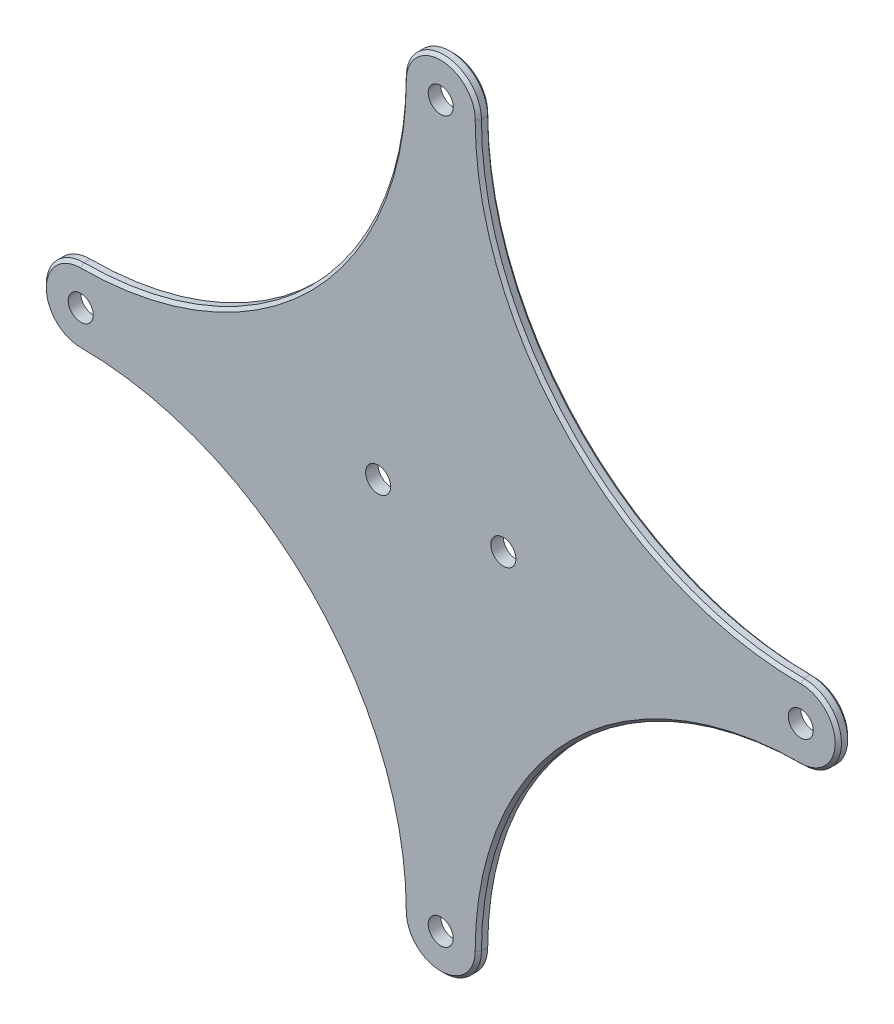
ISO-10303-21;
HEADER;
FILE_DESCRIPTION(('STEP AP214'),'2;1');
FILE_NAME('part.step','',(''),(''),'','','');
FILE_SCHEMA(('AUTOMOTIVE_DESIGN { 1 0 10303 214 1 1 1 1 }'));
ENDSEC;
DATA;
#1=APPLICATION_CONTEXT('core data for automotive mechanical design processes');
#2=APPLICATION_PROTOCOL_DEFINITION('international standard','automotive_design',2000,#1);
#3=PRODUCT_CONTEXT('',#1,'mechanical');
#4=PRODUCT('Part','Part','',(#3));
#5=PRODUCT_RELATED_PRODUCT_CATEGORY('part','',(#4));
#6=PRODUCT_DEFINITION_FORMATION('','',#4);
#7=PRODUCT_DEFINITION_CONTEXT('part definition',#1,'design');
#8=PRODUCT_DEFINITION('design','',#6,#7);
#9=PRODUCT_DEFINITION_SHAPE('','',#8);
#10=(LENGTH_UNIT() NAMED_UNIT(*) SI_UNIT(.MILLI.,.METRE.));
#11=(NAMED_UNIT(*) PLANE_ANGLE_UNIT() SI_UNIT($,.RADIAN.));
#12=(NAMED_UNIT(*) SI_UNIT($,.STERADIAN.) SOLID_ANGLE_UNIT());
#13=UNCERTAINTY_MEASURE_WITH_UNIT(LENGTH_MEASURE(1.E-05),#10,'distance_accuracy_value','');
#14=(GEOMETRIC_REPRESENTATION_CONTEXT(3) GLOBAL_UNCERTAINTY_ASSIGNED_CONTEXT((#13)) GLOBAL_UNIT_ASSIGNED_CONTEXT((#10,
#11,#12)) REPRESENTATION_CONTEXT('',''));
#15=CARTESIAN_POINT('',(0.,0.,0.));
#16=DIRECTION('',(0.,0.,1.));
#17=DIRECTION('',(1.,0.,0.));
#18=AXIS2_PLACEMENT_3D('',#15,#16,#17);
#19=CARTESIAN_POINT('',(0.,0.,4.));
#20=DIRECTION('',(0.,0.,1.));
#21=DIRECTION('',(1.,0.,0.));
#22=AXIS2_PLACEMENT_3D('',#19,#20,#21);
#23=PLANE('',#22);
#24=CARTESIAN_POINT('',(0.,115.,4.));
#25=DIRECTION('',(0.,0.,1.));
#26=DIRECTION('',(1.,0.,0.));
#27=AXIS2_PLACEMENT_3D('',#24,#25,#26);
#28=CIRCLE('',#27,10.9999999999999);
#29=CARTESIAN_POINT('',(11.0000000000002,115.,4.));
#30=VERTEX_POINT('',#29);
#31=CARTESIAN_POINT('',(-10.9999999999999,115.,4.));
#32=VERTEX_POINT('',#31);
#33=EDGE_CURVE('E75',#30,#32,#28,.T.);
#34=ORIENTED_EDGE('',*,*,#33,.T.);
#35=CARTESIAN_POINT('',(-115.000000000003,115.,4.));
#36=DIRECTION('',(0.,0.,1.));
#37=DIRECTION('',(1.,0.,0.));
#38=AXIS2_PLACEMENT_3D('',#35,#36,#37);
#39=CIRCLE('',#38,104.000000000003);
#40=CARTESIAN_POINT('',(-114.999999999997,10.9999999999934,4.));
#41=VERTEX_POINT('',#40);
#42=EDGE_CURVE('E12',#32,#41,#39,.F.);
#43=ORIENTED_EDGE('',*,*,#42,.T.);
#44=CARTESIAN_POINT('',(-114.999999999997,-3.26145486540136E-12,4.));
#45=DIRECTION('',(0.,0.,1.));
#46=DIRECTION('',(1.,0.,0.));
#47=AXIS2_PLACEMENT_3D('',#44,#45,#46);
#48=CIRCLE('',#47,10.9999999999967);
#49=CARTESIAN_POINT('',(-114.999999999997,-10.9999999999967,4.));
#50=VERTEX_POINT('',#49);
#51=EDGE_CURVE('E324',#41,#50,#48,.T.);
#52=ORIENTED_EDGE('',*,*,#51,.T.);
#53=CARTESIAN_POINT('',(-115.000000000003,-115.,4.));
#54=DIRECTION('',(0.,0.,1.));
#55=DIRECTION('',(1.,0.,0.));
#56=AXIS2_PLACEMENT_3D('',#53,#54,#55);
#57=CIRCLE('',#56,104.000000000003);
#58=CARTESIAN_POINT('',(-10.9999999999999,-115.,4.));
#59=VERTEX_POINT('',#58);
#60=EDGE_CURVE('E320',#50,#59,#57,.F.);
#61=ORIENTED_EDGE('',*,*,#60,.T.);
#62=CARTESIAN_POINT('',(0.,-115.,4.));
#63=DIRECTION('',(0.,0.,1.));
#64=DIRECTION('',(1.,0.,0.));
#65=AXIS2_PLACEMENT_3D('',#62,#63,#64);
#66=CIRCLE('',#65,10.9999999999999);
#67=CARTESIAN_POINT('',(11.0000000000003,-115.,4.));
#68=VERTEX_POINT('',#67);
#69=EDGE_CURVE('E316',#59,#68,#66,.T.);
#70=ORIENTED_EDGE('',*,*,#69,.T.);
#71=CARTESIAN_POINT('',(115.000000000003,-115.,4.));
#72=DIRECTION('',(0.,0.,1.));
#73=DIRECTION('',(1.,0.,0.));
#74=AXIS2_PLACEMENT_3D('',#71,#72,#73);
#75=CIRCLE('',#74,104.000000000003);
#76=CARTESIAN_POINT('',(115.000000000003,-10.999999999997,4.));
#77=VERTEX_POINT('',#76);
#78=EDGE_CURVE('E314',#68,#77,#75,.F.);
#79=ORIENTED_EDGE('',*,*,#78,.T.);
#80=CARTESIAN_POINT('',(115.000000000003,3.24737142721117E-12,4.));
#81=DIRECTION('',(0.,0.,1.));
#82=DIRECTION('',(1.,0.,0.));
#83=AXIS2_PLACEMENT_3D('',#80,#81,#82);
#84=CIRCLE('',#83,10.9999999999974);
#85=CARTESIAN_POINT('',(115.000000000003,11.0000000000006,4.));
#86=VERTEX_POINT('',#85);
#87=EDGE_CURVE('E318',#77,#86,#84,.T.);
#88=ORIENTED_EDGE('',*,*,#87,.T.);
#89=CARTESIAN_POINT('',(115.000000000003,115.,4.));
#90=DIRECTION('',(0.,0.,1.));
#91=DIRECTION('',(1.,0.,0.));
#92=AXIS2_PLACEMENT_3D('',#89,#90,#91);
#93=CIRCLE('',#92,104.000000000003);
#94=EDGE_CURVE('E322',#86,#30,#93,.F.);
#95=ORIENTED_EDGE('',*,*,#94,.T.);
#96=EDGE_LOOP('',(#34,#43,#52,#61,#70,#79,#88,#95));
#97=FACE_BOUND('',#96,.T.);
#98=CARTESIAN_POINT('',(-114.999999999997,-3.26145486540136E-12,4.));
#99=DIRECTION('',(0.,0.,1.));
#100=DIRECTION('',(1.,0.,0.));
#101=AXIS2_PLACEMENT_3D('',#98,#99,#100);
#102=CIRCLE('',#101,4.00000000000521);
#103=CARTESIAN_POINT('',(-110.999999999992,-3.26145486540136E-12,4.));
#104=VERTEX_POINT('',#103);
#105=EDGE_CURVE('E245',#104,#104,#102,.T.);
#106=ORIENTED_EDGE('',*,*,#105,.F.);
#107=EDGE_LOOP('',(#106));
#108=FACE_BOUND('',#107,.T.);
#109=CARTESIAN_POINT('',(115.000000000003,3.24737142721117E-12,4.));
#110=DIRECTION('',(0.,0.,1.));
#111=DIRECTION('',(1.,0.,0.));
#112=AXIS2_PLACEMENT_3D('',#109,#110,#111);
#113=CIRCLE('',#112,4.00000000000254);
#114=CARTESIAN_POINT('',(119.000000000006,3.24737142721117E-12,4.));
#115=VERTEX_POINT('',#114);
#116=EDGE_CURVE('E257',#115,#115,#113,.T.);
#117=ORIENTED_EDGE('',*,*,#116,.F.);
#118=EDGE_LOOP('',(#117));
#119=FACE_BOUND('',#118,.T.);
#120=CARTESIAN_POINT('',(0.,115.,4.));
#121=DIRECTION('',(0.,0.,1.));
#122=DIRECTION('',(1.,0.,0.));
#123=AXIS2_PLACEMENT_3D('',#120,#121,#122);
#124=CIRCLE('',#123,4.);
#125=CARTESIAN_POINT('',(4.,115.,4.));
#126=VERTEX_POINT('',#125);
#127=EDGE_CURVE('E269',#126,#126,#124,.T.);
#128=ORIENTED_EDGE('',*,*,#127,.F.);
#129=EDGE_LOOP('',(#128));
#130=FACE_BOUND('',#129,.T.);
#131=CARTESIAN_POINT('',(-20.,0.,4.));
#132=DIRECTION('',(0.,0.,1.));
#133=DIRECTION('',(1.,0.,0.));
#134=AXIS2_PLACEMENT_3D('',#131,#132,#133);
#135=CIRCLE('',#134,4.);
#136=CARTESIAN_POINT('',(-16.,0.,4.));
#137=VERTEX_POINT('',#136);
#138=EDGE_CURVE('E263',#137,#137,#135,.T.);
#139=ORIENTED_EDGE('',*,*,#138,.F.);
#140=EDGE_LOOP('',(#139));
#141=FACE_BOUND('',#140,.T.);
#142=CARTESIAN_POINT('',(6.49474285442234E-12,-115.,4.));
#143=DIRECTION('',(0.,0.,1.));
#144=DIRECTION('',(1.,0.,0.));
#145=AXIS2_PLACEMENT_3D('',#142,#143,#144);
#146=CIRCLE('',#145,4.00000000000698);
#147=CARTESIAN_POINT('',(4.00000000001347,-115.,4.));
#148=VERTEX_POINT('',#147);
#149=EDGE_CURVE('E251',#148,#148,#146,.T.);
#150=ORIENTED_EDGE('',*,*,#149,.F.);
#151=EDGE_LOOP('',(#150));
#152=FACE_BOUND('',#151,.T.);
#153=CARTESIAN_POINT('',(20.,0.,4.));
#154=DIRECTION('',(0.,0.,1.));
#155=DIRECTION('',(1.,0.,0.));
#156=AXIS2_PLACEMENT_3D('',#153,#154,#155);
#157=CIRCLE('',#156,4.);
#158=CARTESIAN_POINT('',(24.,0.,4.));
#159=VERTEX_POINT('',#158);
#160=EDGE_CURVE('E239',#159,#159,#157,.T.);
#161=ORIENTED_EDGE('',*,*,#160,.F.);
#162=EDGE_LOOP('',(#161));
#163=FACE_BOUND('',#162,.T.);
#164=ADVANCED_FACE('F65',(#97,#108,#119,#130,#141,#152,#163),#23,.T.);
#165=CARTESIAN_POINT('',(0.,0.,0.));
#166=DIRECTION('',(0.,0.,1.));
#167=DIRECTION('',(1.,0.,0.));
#168=AXIS2_PLACEMENT_3D('',#165,#166,#167);
#169=PLANE('',#168);
#170=CARTESIAN_POINT('',(0.,115.,0.));
#171=DIRECTION('',(0.,0.,1.));
#172=DIRECTION('',(1.,0.,0.));
#173=AXIS2_PLACEMENT_3D('',#170,#171,#172);
#174=CIRCLE('',#173,11.);
#175=CARTESIAN_POINT('',(-11.,115.,0.));
#176=VERTEX_POINT('',#175);
#177=CARTESIAN_POINT('',(11.,115.,0.));
#178=VERTEX_POINT('',#177);
#179=EDGE_CURVE('E286',#176,#178,#174,.F.);
#180=ORIENTED_EDGE('',*,*,#179,.T.);
#181=CARTESIAN_POINT('',(115.000000000003,115.,0.));
#182=DIRECTION('',(0.,0.,1.));
#183=DIRECTION('',(1.,0.,0.));
#184=AXIS2_PLACEMENT_3D('',#181,#182,#183);
#185=CIRCLE('',#184,104.000000000003);
#186=CARTESIAN_POINT('',(115.000000000003,11.0000000000007,0.));
#187=VERTEX_POINT('',#186);
#188=EDGE_CURVE('E188',#178,#187,#185,.T.);
#189=ORIENTED_EDGE('',*,*,#188,.T.);
#190=CARTESIAN_POINT('',(115.000000000003,3.24737142721117E-12,0.));
#191=DIRECTION('',(0.,0.,1.));
#192=DIRECTION('',(1.,0.,0.));
#193=AXIS2_PLACEMENT_3D('',#190,#191,#192);
#194=CIRCLE('',#193,10.9999999999975);
#195=CARTESIAN_POINT('',(115.000000000003,-10.9999999999971,0.));
#196=VERTEX_POINT('',#195);
#197=EDGE_CURVE('E284',#187,#196,#194,.F.);
#198=ORIENTED_EDGE('',*,*,#197,.T.);
#199=CARTESIAN_POINT('',(115.000000000003,-115.,0.));
#200=DIRECTION('',(0.,0.,1.));
#201=DIRECTION('',(1.,0.,0.));
#202=AXIS2_PLACEMENT_3D('',#199,#200,#201);
#203=CIRCLE('',#202,104.000000000003);
#204=CARTESIAN_POINT('',(11.,-115.,0.));
#205=VERTEX_POINT('',#204);
#206=EDGE_CURVE('E280',#196,#205,#203,.T.);
#207=ORIENTED_EDGE('',*,*,#206,.T.);
#208=CARTESIAN_POINT('',(0.,-115.,0.));
#209=DIRECTION('',(0.,0.,1.));
#210=DIRECTION('',(1.,0.,0.));
#211=AXIS2_PLACEMENT_3D('',#208,#209,#210);
#212=CIRCLE('',#211,11.);
#213=CARTESIAN_POINT('',(-11.0000000000001,-115.,0.));
#214=VERTEX_POINT('',#213);
#215=EDGE_CURVE('E276',#205,#214,#212,.F.);
#216=ORIENTED_EDGE('',*,*,#215,.T.);
#217=CARTESIAN_POINT('',(-115.000000000003,-115.,0.));
#218=DIRECTION('',(0.,0.,1.));
#219=DIRECTION('',(1.,0.,0.));
#220=AXIS2_PLACEMENT_3D('',#217,#218,#219);
#221=CIRCLE('',#220,104.000000000003);
#222=CARTESIAN_POINT('',(-114.999999999997,-10.9999999999968,0.));
#223=VERTEX_POINT('',#222);
#224=EDGE_CURVE('E214',#214,#223,#221,.T.);
#225=ORIENTED_EDGE('',*,*,#224,.T.);
#226=CARTESIAN_POINT('',(-114.999999999997,-3.26145486540136E-12,0.));
#227=DIRECTION('',(0.,0.,1.));
#228=DIRECTION('',(1.,0.,0.));
#229=AXIS2_PLACEMENT_3D('',#226,#227,#228);
#230=CIRCLE('',#229,10.9999999999968);
#231=CARTESIAN_POINT('',(-114.999999999997,10.9999999999935,0.));
#232=VERTEX_POINT('',#231);
#233=EDGE_CURVE('E278',#223,#232,#230,.F.);
#234=ORIENTED_EDGE('',*,*,#233,.T.);
#235=CARTESIAN_POINT('',(-115.000000000003,115.,0.));
#236=DIRECTION('',(0.,0.,1.));
#237=DIRECTION('',(1.,0.,0.));
#238=AXIS2_PLACEMENT_3D('',#235,#236,#237);
#239=CIRCLE('',#238,104.000000000003);
#240=EDGE_CURVE('E282',#232,#176,#239,.T.);
#241=ORIENTED_EDGE('',*,*,#240,.T.);
#242=EDGE_LOOP('',(#180,#189,#198,#207,#216,#225,#234,#241));
#243=FACE_BOUND('',#242,.T.);
#244=CARTESIAN_POINT('',(0.,115.,0.));
#245=DIRECTION('',(0.,0.,1.));
#246=DIRECTION('',(1.,0.,0.));
#247=AXIS2_PLACEMENT_3D('',#244,#245,#246);
#248=CIRCLE('',#247,4.);
#249=CARTESIAN_POINT('',(4.,115.,0.));
#250=VERTEX_POINT('',#249);
#251=EDGE_CURVE('E266',#250,#250,#248,.T.);
#252=ORIENTED_EDGE('',*,*,#251,.T.);
#253=EDGE_LOOP('',(#252));
#254=FACE_BOUND('',#253,.T.);
#255=CARTESIAN_POINT('',(-20.,0.,0.));
#256=DIRECTION('',(0.,0.,1.));
#257=DIRECTION('',(1.,0.,0.));
#258=AXIS2_PLACEMENT_3D('',#255,#256,#257);
#259=CIRCLE('',#258,4.);
#260=CARTESIAN_POINT('',(-16.,0.,0.));
#261=VERTEX_POINT('',#260);
#262=EDGE_CURVE('E260',#261,#261,#259,.T.);
#263=ORIENTED_EDGE('',*,*,#262,.T.);
#264=EDGE_LOOP('',(#263));
#265=FACE_BOUND('',#264,.T.);
#266=CARTESIAN_POINT('',(115.000000000003,3.24737142721117E-12,0.));
#267=DIRECTION('',(0.,0.,1.));
#268=DIRECTION('',(1.,0.,0.));
#269=AXIS2_PLACEMENT_3D('',#266,#267,#268);
#270=CIRCLE('',#269,4.00000000000254);
#271=CARTESIAN_POINT('',(119.000000000006,3.24737142721117E-12,0.));
#272=VERTEX_POINT('',#271);
#273=EDGE_CURVE('E254',#272,#272,#270,.T.);
#274=ORIENTED_EDGE('',*,*,#273,.T.);
#275=EDGE_LOOP('',(#274));
#276=FACE_BOUND('',#275,.T.);
#277=CARTESIAN_POINT('',(6.49474285442234E-12,-115.,0.));
#278=DIRECTION('',(0.,0.,1.));
#279=DIRECTION('',(1.,0.,0.));
#280=AXIS2_PLACEMENT_3D('',#277,#278,#279);
#281=CIRCLE('',#280,4.00000000000698);
#282=CARTESIAN_POINT('',(4.00000000001347,-115.,0.));
#283=VERTEX_POINT('',#282);
#284=EDGE_CURVE('E248',#283,#283,#281,.T.);
#285=ORIENTED_EDGE('',*,*,#284,.T.);
#286=EDGE_LOOP('',(#285));
#287=FACE_BOUND('',#286,.T.);
#288=CARTESIAN_POINT('',(-114.999999999997,-3.26145486540136E-12,0.));
#289=DIRECTION('',(0.,0.,1.));
#290=DIRECTION('',(1.,0.,0.));
#291=AXIS2_PLACEMENT_3D('',#288,#289,#290);
#292=CIRCLE('',#291,4.00000000000521);
#293=CARTESIAN_POINT('',(-110.999999999992,-3.26145486540136E-12,0.));
#294=VERTEX_POINT('',#293);
#295=EDGE_CURVE('E242',#294,#294,#292,.T.);
#296=ORIENTED_EDGE('',*,*,#295,.T.);
#297=EDGE_LOOP('',(#296));
#298=FACE_BOUND('',#297,.T.);
#299=CARTESIAN_POINT('',(20.,0.,0.));
#300=DIRECTION('',(0.,0.,1.));
#301=DIRECTION('',(1.,0.,0.));
#302=AXIS2_PLACEMENT_3D('',#299,#300,#301);
#303=CIRCLE('',#302,4.);
#304=CARTESIAN_POINT('',(24.,0.,0.));
#305=VERTEX_POINT('',#304);
#306=EDGE_CURVE('E238',#305,#305,#303,.T.);
#307=ORIENTED_EDGE('',*,*,#306,.T.);
#308=EDGE_LOOP('',(#307));
#309=FACE_BOUND('',#308,.T.);
#310=ADVANCED_FACE('F432',(#243,#254,#265,#276,#287,#298,#309),#169,.F.);
#311=CARTESIAN_POINT('',(0.,115.,4.));
#312=DIRECTION('',(0.,0.,-1.));
#313=DIRECTION('',(-1.,0.,0.));
#314=AXIS2_PLACEMENT_3D('',#311,#312,#313);
#315=CYLINDRICAL_SURFACE('',#314,4.);
#316=ORIENTED_EDGE('',*,*,#127,.T.);
#317=EDGE_LOOP('',(#316));
#318=FACE_BOUND('',#317,.T.);
#319=ORIENTED_EDGE('',*,*,#251,.F.);
#320=EDGE_LOOP('',(#319));
#321=FACE_BOUND('',#320,.T.);
#322=ADVANCED_FACE('F435',(#318,#321),#315,.F.);
#323=CARTESIAN_POINT('',(-20.,0.,4.));
#324=DIRECTION('',(0.,0.,-1.));
#325=DIRECTION('',(-1.,0.,0.));
#326=AXIS2_PLACEMENT_3D('',#323,#324,#325);
#327=CYLINDRICAL_SURFACE('',#326,4.);
#328=ORIENTED_EDGE('',*,*,#138,.T.);
#329=EDGE_LOOP('',(#328));
#330=FACE_BOUND('',#329,.T.);
#331=ORIENTED_EDGE('',*,*,#262,.F.);
#332=EDGE_LOOP('',(#331));
#333=FACE_BOUND('',#332,.T.);
#334=ADVANCED_FACE('F672',(#330,#333),#327,.F.);
#335=CARTESIAN_POINT('',(115.000000000003,3.24737142721117E-12,4.));
#336=DIRECTION('',(0.,0.,-1.));
#337=DIRECTION('',(-1.,0.,0.));
#338=AXIS2_PLACEMENT_3D('',#335,#336,#337);
#339=CYLINDRICAL_SURFACE('',#338,4.00000000000254);
#340=ORIENTED_EDGE('',*,*,#116,.T.);
#341=EDGE_LOOP('',(#340));
#342=FACE_BOUND('',#341,.T.);
#343=ORIENTED_EDGE('',*,*,#273,.F.);
#344=EDGE_LOOP('',(#343));
#345=FACE_BOUND('',#344,.T.);
#346=ADVANCED_FACE('F662',(#342,#345),#339,.F.);
#347=CARTESIAN_POINT('',(6.49474285442234E-12,-115.,4.));
#348=DIRECTION('',(0.,0.,-1.));
#349=DIRECTION('',(-1.,0.,0.));
#350=AXIS2_PLACEMENT_3D('',#347,#348,#349);
#351=CYLINDRICAL_SURFACE('',#350,4.00000000000698);
#352=ORIENTED_EDGE('',*,*,#149,.T.);
#353=EDGE_LOOP('',(#352));
#354=FACE_BOUND('',#353,.T.);
#355=ORIENTED_EDGE('',*,*,#284,.F.);
#356=EDGE_LOOP('',(#355));
#357=FACE_BOUND('',#356,.T.);
#358=ADVANCED_FACE('F459',(#354,#357),#351,.F.);
#359=CARTESIAN_POINT('',(-114.999999999997,-3.26145486540136E-12,4.));
#360=DIRECTION('',(0.,0.,-1.));
#361=DIRECTION('',(-1.,0.,0.));
#362=AXIS2_PLACEMENT_3D('',#359,#360,#361);
#363=CYLINDRICAL_SURFACE('',#362,4.00000000000521);
#364=ORIENTED_EDGE('',*,*,#105,.T.);
#365=EDGE_LOOP('',(#364));
#366=FACE_BOUND('',#365,.T.);
#367=ORIENTED_EDGE('',*,*,#295,.F.);
#368=EDGE_LOOP('',(#367));
#369=FACE_BOUND('',#368,.T.);
#370=ADVANCED_FACE('F451',(#366,#369),#363,.F.);
#371=CARTESIAN_POINT('',(20.,0.,4.));
#372=DIRECTION('',(0.,0.,-1.));
#373=DIRECTION('',(-1.,0.,0.));
#374=AXIS2_PLACEMENT_3D('',#371,#372,#373);
#375=CYLINDRICAL_SURFACE('',#374,4.);
#376=ORIENTED_EDGE('',*,*,#160,.T.);
#377=EDGE_LOOP('',(#376));
#378=FACE_BOUND('',#377,.T.);
#379=ORIENTED_EDGE('',*,*,#306,.F.);
#380=EDGE_LOOP('',(#379));
#381=FACE_BOUND('',#380,.T.);
#382=ADVANCED_FACE('F449',(#378,#381),#375,.F.);
#383=CARTESIAN_POINT('',(115.000000000003,-115.,-6.));
#384=DIRECTION('',(0.,0.,1.));
#385=DIRECTION('',(1.,0.,0.));
#386=AXIS2_PLACEMENT_3D('',#383,#384,#385);
#387=CYLINDRICAL_SURFACE('',#386,103.000000000003);
#388=DIRECTION('',(0.,0.,1.));
#389=VECTOR('',#388,1.);
#390=CARTESIAN_POINT('',(12.,-115.,-6.));
#391=LINE('',#390,#389);
#392=CARTESIAN_POINT('',(12.,-115.,0.999999999999973));
#393=VERTEX_POINT('',#392);
#394=CARTESIAN_POINT('',(12.,-115.,2.99999999999993));
#395=VERTEX_POINT('',#394);
#396=EDGE_CURVE('E235',#393,#395,#391,.T.);
#397=ORIENTED_EDGE('',*,*,#396,.F.);
#398=CARTESIAN_POINT('',(115.000000000003,-115.,0.999999999999973));
#399=DIRECTION('',(0.,0.,1.));
#400=DIRECTION('',(1.,0.,0.));
#401=AXIS2_PLACEMENT_3D('',#398,#399,#400);
#402=CIRCLE('',#401,103.000000000003);
#403=CARTESIAN_POINT('',(115.000000000003,-11.9999999999942,0.999999999999973));
#404=VERTEX_POINT('',#403);
#405=EDGE_CURVE('E300',#393,#404,#402,.F.);
#406=ORIENTED_EDGE('',*,*,#405,.T.);
#407=DIRECTION('',(0.,0.,1.));
#408=VECTOR('',#407,1.);
#409=CARTESIAN_POINT('',(115.000000000003,-11.9999999999942,-6.));
#410=LINE('',#409,#408);
#411=CARTESIAN_POINT('',(115.000000000003,-11.9999999999942,2.99999999999993));
#412=VERTEX_POINT('',#411);
#413=EDGE_CURVE('E223',#404,#412,#410,.T.);
#414=ORIENTED_EDGE('',*,*,#413,.T.);
#415=CARTESIAN_POINT('',(115.000000000003,-115.,2.99999999999993));
#416=DIRECTION('',(0.,0.,1.));
#417=DIRECTION('',(1.,0.,0.));
#418=AXIS2_PLACEMENT_3D('',#415,#416,#417);
#419=CIRCLE('',#418,103.000000000003);
#420=EDGE_CURVE('E298',#412,#395,#419,.T.);
#421=ORIENTED_EDGE('',*,*,#420,.T.);
#422=EDGE_LOOP('',(#397,#406,#414,#421));
#423=FACE_BOUND('',#422,.T.);
#424=ADVANCED_FACE('F418',(#423),#387,.F.);
#425=CARTESIAN_POINT('',(0.,-115.,-6.));
#426=DIRECTION('',(0.,0.,1.));
#427=DIRECTION('',(1.,0.,0.));
#428=AXIS2_PLACEMENT_3D('',#425,#426,#427);
#429=CYLINDRICAL_SURFACE('',#428,12.);
#430=DIRECTION('',(0.,0.,1.));
#431=VECTOR('',#430,1.);
#432=CARTESIAN_POINT('',(-12.,-115.,-6.));
#433=LINE('',#432,#431);
#434=CARTESIAN_POINT('',(-12.,-115.,0.999999999999973));
#435=VERTEX_POINT('',#434);
#436=CARTESIAN_POINT('',(-12.,-115.,2.99999999999993));
#437=VERTEX_POINT('',#436);
#438=EDGE_CURVE('E232',#435,#437,#433,.T.);
#439=ORIENTED_EDGE('',*,*,#438,.F.);
#440=CARTESIAN_POINT('',(0.,-115.,0.999999999999973));
#441=DIRECTION('',(0.,0.,1.));
#442=DIRECTION('',(1.,0.,0.));
#443=AXIS2_PLACEMENT_3D('',#440,#441,#442);
#444=CIRCLE('',#443,12.);
#445=EDGE_CURVE('E308',#435,#393,#444,.T.);
#446=ORIENTED_EDGE('',*,*,#445,.T.);
#447=ORIENTED_EDGE('',*,*,#396,.T.);
#448=CARTESIAN_POINT('',(0.,-115.,2.99999999999993));
#449=DIRECTION('',(0.,0.,1.));
#450=DIRECTION('',(1.,0.,0.));
#451=AXIS2_PLACEMENT_3D('',#448,#449,#450);
#452=CIRCLE('',#451,12.);
#453=EDGE_CURVE('E306',#395,#437,#452,.F.);
#454=ORIENTED_EDGE('',*,*,#453,.T.);
#455=EDGE_LOOP('',(#439,#446,#447,#454));
#456=FACE_BOUND('',#455,.T.);
#457=ADVANCED_FACE('F416',(#456),#429,.T.);
#458=CARTESIAN_POINT('',(-115.000000000003,-115.,-6.));
#459=DIRECTION('',(0.,0.,1.));
#460=DIRECTION('',(1.,0.,0.));
#461=AXIS2_PLACEMENT_3D('',#458,#459,#460);
#462=CYLINDRICAL_SURFACE('',#461,103.000000000003);
#463=DIRECTION('',(0.,0.,1.));
#464=VECTOR('',#463,1.);
#465=CARTESIAN_POINT('',(-114.999999999997,-11.9999999999968,-6.));
#466=LINE('',#465,#464);
#467=CARTESIAN_POINT('',(-114.999999999997,-11.9999999999968,0.999999999999973));
#468=VERTEX_POINT('',#467);
#469=CARTESIAN_POINT('',(-114.999999999997,-11.9999999999968,2.99999999999993));
#470=VERTEX_POINT('',#469);
#471=EDGE_CURVE('E229',#468,#470,#466,.T.);
#472=ORIENTED_EDGE('',*,*,#471,.F.);
#473=CARTESIAN_POINT('',(-115.000000000003,-115.,0.999999999999973));
#474=DIRECTION('',(0.,0.,1.));
#475=DIRECTION('',(1.,0.,0.));
#476=AXIS2_PLACEMENT_3D('',#473,#474,#475);
#477=CIRCLE('',#476,103.000000000003);
#478=EDGE_CURVE('E312',#468,#435,#477,.F.);
#479=ORIENTED_EDGE('',*,*,#478,.T.);
#480=ORIENTED_EDGE('',*,*,#438,.T.);
#481=CARTESIAN_POINT('',(-115.000000000003,-115.,2.99999999999993));
#482=DIRECTION('',(0.,0.,1.));
#483=DIRECTION('',(1.,0.,0.));
#484=AXIS2_PLACEMENT_3D('',#481,#482,#483);
#485=CIRCLE('',#484,103.000000000003);
#486=EDGE_CURVE('E310',#437,#470,#485,.T.);
#487=ORIENTED_EDGE('',*,*,#486,.T.);
#488=EDGE_LOOP('',(#472,#479,#480,#487));
#489=FACE_BOUND('',#488,.T.);
#490=ADVANCED_FACE('F402',(#489),#462,.F.);
#491=CARTESIAN_POINT('',(-114.999999999997,-3.26145486540136E-12,-6.));
#492=DIRECTION('',(0.,0.,1.));
#493=DIRECTION('',(1.,0.,0.));
#494=AXIS2_PLACEMENT_3D('',#491,#492,#493);
#495=CYLINDRICAL_SURFACE('',#494,11.9999999999968);
#496=DIRECTION('',(0.,0.,1.));
#497=VECTOR('',#496,1.);
#498=CARTESIAN_POINT('',(-114.999999999997,11.9999999999935,-6.));
#499=LINE('',#498,#497);
#500=CARTESIAN_POINT('',(-114.999999999997,11.9999999999935,0.999999999999973));
#501=VERTEX_POINT('',#500);
#502=CARTESIAN_POINT('',(-114.999999999997,11.9999999999935,2.99999999999993));
#503=VERTEX_POINT('',#502);
#504=EDGE_CURVE('E221',#501,#503,#499,.T.);
#505=ORIENTED_EDGE('',*,*,#504,.F.);
#506=CARTESIAN_POINT('',(-114.999999999997,-3.26145486540136E-12,0.999999999999973));
#507=DIRECTION('',(0.,0.,1.));
#508=DIRECTION('',(1.,0.,0.));
#509=AXIS2_PLACEMENT_3D('',#506,#507,#508);
#510=CIRCLE('',#509,11.9999999999968);
#511=EDGE_CURVE('E304',#501,#468,#510,.T.);
#512=ORIENTED_EDGE('',*,*,#511,.T.);
#513=ORIENTED_EDGE('',*,*,#471,.T.);
#514=CARTESIAN_POINT('',(-114.999999999997,-3.26145486540136E-12,2.99999999999993));
#515=DIRECTION('',(0.,0.,1.));
#516=DIRECTION('',(1.,0.,0.));
#517=AXIS2_PLACEMENT_3D('',#514,#515,#516);
#518=CIRCLE('',#517,11.9999999999968);
#519=EDGE_CURVE('E302',#470,#503,#518,.F.);
#520=ORIENTED_EDGE('',*,*,#519,.T.);
#521=EDGE_LOOP('',(#505,#512,#513,#520));
#522=FACE_BOUND('',#521,.T.);
#523=ADVANCED_FACE('F386',(#522),#495,.T.);
#524=CARTESIAN_POINT('',(-115.000000000003,115.,-6.));
#525=DIRECTION('',(0.,0.,1.));
#526=DIRECTION('',(1.,0.,0.));
#527=AXIS2_PLACEMENT_3D('',#524,#525,#526);
#528=CYLINDRICAL_SURFACE('',#527,103.000000000003);
#529=DIRECTION('',(0.,0.,1.));
#530=VECTOR('',#529,1.);
#531=CARTESIAN_POINT('',(-12.,115.,-6.));
#532=LINE('',#531,#530);
#533=CARTESIAN_POINT('',(-12.,115.,0.999999999999973));
#534=VERTEX_POINT('',#533);
#535=CARTESIAN_POINT('',(-12.,115.,2.99999999999993));
#536=VERTEX_POINT('',#535);
#537=EDGE_CURVE('E219',#534,#536,#532,.T.);
#538=ORIENTED_EDGE('',*,*,#537,.F.);
#539=CARTESIAN_POINT('',(-115.000000000003,115.,0.999999999999973));
#540=DIRECTION('',(0.,0.,1.));
#541=DIRECTION('',(1.,0.,0.));
#542=AXIS2_PLACEMENT_3D('',#539,#540,#541);
#543=CIRCLE('',#542,103.000000000003);
#544=EDGE_CURVE('E296',#534,#501,#543,.F.);
#545=ORIENTED_EDGE('',*,*,#544,.T.);
#546=ORIENTED_EDGE('',*,*,#504,.T.);
#547=CARTESIAN_POINT('',(-115.000000000003,115.,2.99999999999993));
#548=DIRECTION('',(0.,0.,1.));
#549=DIRECTION('',(1.,0.,0.));
#550=AXIS2_PLACEMENT_3D('',#547,#548,#549);
#551=CIRCLE('',#550,103.000000000003);
#552=EDGE_CURVE('E293',#503,#536,#551,.T.);
#553=ORIENTED_EDGE('',*,*,#552,.T.);
#554=EDGE_LOOP('',(#538,#545,#546,#553));
#555=FACE_BOUND('',#554,.T.);
#556=ADVANCED_FACE('F390',(#555),#528,.F.);
#557=CARTESIAN_POINT('',(0.,115.,-6.));
#558=DIRECTION('',(0.,0.,1.));
#559=DIRECTION('',(1.,0.,0.));
#560=AXIS2_PLACEMENT_3D('',#557,#558,#559);
#561=CYLINDRICAL_SURFACE('',#560,12.);
#562=DIRECTION('',(0.,0.,1.));
#563=VECTOR('',#562,1.);
#564=CARTESIAN_POINT('',(12.,115.,-6.));
#565=LINE('',#564,#563);
#566=CARTESIAN_POINT('',(12.,115.,0.999999999999973));
#567=VERTEX_POINT('',#566);
#568=CARTESIAN_POINT('',(12.,115.,2.99999999999993));
#569=VERTEX_POINT('',#568);
#570=EDGE_CURVE('E209',#567,#569,#565,.T.);
#571=ORIENTED_EDGE('',*,*,#570,.F.);
#572=CARTESIAN_POINT('',(0.,115.,0.999999999999973));
#573=DIRECTION('',(0.,0.,1.));
#574=DIRECTION('',(1.,0.,0.));
#575=AXIS2_PLACEMENT_3D('',#572,#573,#574);
#576=CIRCLE('',#575,12.);
#577=EDGE_CURVE('E194',#567,#534,#576,.T.);
#578=ORIENTED_EDGE('',*,*,#577,.T.);
#579=ORIENTED_EDGE('',*,*,#537,.T.);
#580=CARTESIAN_POINT('',(0.,115.,2.99999999999993));
#581=DIRECTION('',(0.,0.,1.));
#582=DIRECTION('',(1.,0.,0.));
#583=AXIS2_PLACEMENT_3D('',#580,#581,#582);
#584=CIRCLE('',#583,12.);
#585=EDGE_CURVE('E203',#536,#569,#584,.F.);
#586=ORIENTED_EDGE('',*,*,#585,.T.);
#587=EDGE_LOOP('',(#571,#578,#579,#586));
#588=FACE_BOUND('',#587,.T.);
#589=ADVANCED_FACE('F217',(#588),#561,.T.);
#590=CARTESIAN_POINT('',(115.000000000003,115.,-6.));
#591=DIRECTION('',(0.,0.,1.));
#592=DIRECTION('',(1.,0.,0.));
#593=AXIS2_PLACEMENT_3D('',#590,#591,#592);
#594=CYLINDRICAL_SURFACE('',#593,103.000000000003);
#595=DIRECTION('',(0.,0.,1.));
#596=VECTOR('',#595,1.);
#597=CARTESIAN_POINT('',(115.000000000003,11.9999999999971,-6.));
#598=LINE('',#597,#596);
#599=CARTESIAN_POINT('',(115.000000000003,11.9999999999971,0.999999999999973));
#600=VERTEX_POINT('',#599);
#601=CARTESIAN_POINT('',(115.000000000003,11.9999999999971,2.99999999999993));
#602=VERTEX_POINT('',#601);
#603=EDGE_CURVE('E212',#600,#602,#598,.T.);
#604=ORIENTED_EDGE('',*,*,#603,.F.);
#605=CARTESIAN_POINT('',(115.000000000003,115.,0.999999999999973));
#606=DIRECTION('',(0.,0.,1.));
#607=DIRECTION('',(1.,0.,0.));
#608=AXIS2_PLACEMENT_3D('',#605,#606,#607);
#609=CIRCLE('',#608,103.000000000003);
#610=EDGE_CURVE('E186',#600,#567,#609,.F.);
#611=ORIENTED_EDGE('',*,*,#610,.T.);
#612=ORIENTED_EDGE('',*,*,#570,.T.);
#613=CARTESIAN_POINT('',(115.000000000003,115.,2.99999999999993));
#614=DIRECTION('',(0.,0.,1.));
#615=DIRECTION('',(1.,0.,0.));
#616=AXIS2_PLACEMENT_3D('',#613,#614,#615);
#617=CIRCLE('',#616,103.000000000003);
#618=EDGE_CURVE('E215',#569,#602,#617,.T.);
#619=ORIENTED_EDGE('',*,*,#618,.T.);
#620=EDGE_LOOP('',(#604,#611,#612,#619));
#621=FACE_BOUND('',#620,.T.);
#622=ADVANCED_FACE('F208',(#621),#594,.F.);
#623=CARTESIAN_POINT('',(115.000000000003,3.24737142721117E-12,-6.));
#624=DIRECTION('',(0.,0.,1.));
#625=DIRECTION('',(1.,0.,0.));
#626=AXIS2_PLACEMENT_3D('',#623,#624,#625);
#627=CYLINDRICAL_SURFACE('',#626,11.9999999999975);
#628=ORIENTED_EDGE('',*,*,#413,.F.);
#629=CARTESIAN_POINT('',(115.000000000003,3.24737142721117E-12,0.999999999999973));
#630=DIRECTION('',(0.,0.,1.));
#631=DIRECTION('',(1.,0.,0.));
#632=AXIS2_PLACEMENT_3D('',#629,#630,#631);
#633=CIRCLE('',#632,11.9999999999975);
#634=EDGE_CURVE('E291',#404,#600,#633,.T.);
#635=ORIENTED_EDGE('',*,*,#634,.T.);
#636=ORIENTED_EDGE('',*,*,#603,.T.);
#637=CARTESIAN_POINT('',(115.000000000003,3.24737142721117E-12,2.99999999999993));
#638=DIRECTION('',(0.,0.,1.));
#639=DIRECTION('',(1.,0.,0.));
#640=AXIS2_PLACEMENT_3D('',#637,#638,#639);
#641=CIRCLE('',#640,11.9999999999975);
#642=EDGE_CURVE('E202',#602,#412,#641,.F.);
#643=ORIENTED_EDGE('',*,*,#642,.T.);
#644=EDGE_LOOP('',(#628,#635,#636,#643));
#645=FACE_BOUND('',#644,.T.);
#646=ADVANCED_FACE('F423',(#645),#627,.T.);
#647=CARTESIAN_POINT('',(-115.000000000003,-115.,0.999999999999973));
#648=DIRECTION('',(0.,0.,-1.));
#649=DIRECTION('',(-1.,0.,0.));
#650=AXIS2_PLACEMENT_3D('',#647,#648,#649);
#651=CONICAL_SURFACE('',#650,103.000000000003,0.785398163397455);
#652=DIRECTION('',(0.,-0.707106781186552,0.707106781186543));
#653=VECTOR('',#652,1.);
#654=CARTESIAN_POINT('',(-114.999999999997,-10.9999999999968,0.));
#655=LINE('',#654,#653);
#656=EDGE_CURVE('E338',#223,#468,#655,.T.);
#657=ORIENTED_EDGE('',*,*,#656,.F.);
#658=ORIENTED_EDGE('',*,*,#224,.F.);
#659=DIRECTION('',(0.707106781186552,0.,-0.707106781186543));
#660=VECTOR('',#659,1.);
#661=CARTESIAN_POINT('',(-12.,-115.,0.999999999999973));
#662=LINE('',#661,#660);
#663=EDGE_CURVE('E341',#435,#214,#662,.T.);
#664=ORIENTED_EDGE('',*,*,#663,.F.);
#665=ORIENTED_EDGE('',*,*,#478,.F.);
#666=EDGE_LOOP('',(#657,#658,#664,#665));
#667=FACE_BOUND('',#666,.T.);
#668=ADVANCED_FACE('F406',(#667),#651,.F.);
#669=CARTESIAN_POINT('',(0.,-115.,0.));
#670=DIRECTION('',(0.,0.,1.));
#671=DIRECTION('',(1.,0.,0.));
#672=AXIS2_PLACEMENT_3D('',#669,#670,#671);
#673=CONICAL_SURFACE('',#672,11.,0.785398163397455);
#674=ORIENTED_EDGE('',*,*,#663,.T.);
#675=ORIENTED_EDGE('',*,*,#215,.F.);
#676=DIRECTION('',(-0.707106781186552,0.,-0.707106781186543));
#677=VECTOR('',#676,1.);
#678=CARTESIAN_POINT('',(12.,-115.,0.999999999999973));
#679=LINE('',#678,#677);
#680=EDGE_CURVE('E335',#393,#205,#679,.T.);
#681=ORIENTED_EDGE('',*,*,#680,.F.);
#682=ORIENTED_EDGE('',*,*,#445,.F.);
#683=EDGE_LOOP('',(#674,#675,#681,#682));
#684=FACE_BOUND('',#683,.T.);
#685=ADVANCED_FACE('F412',(#684),#673,.T.);
#686=CARTESIAN_POINT('',(-114.999999999997,-3.26145486540136E-12,0.999999999999973));
#687=DIRECTION('',(0.,0.,1.));
#688=DIRECTION('',(1.,0.,0.));
#689=AXIS2_PLACEMENT_3D('',#686,#687,#688);
#690=CONICAL_SURFACE('',#689,11.9999999999968,0.785398163397455);
#691=ORIENTED_EDGE('',*,*,#656,.T.);
#692=ORIENTED_EDGE('',*,*,#511,.F.);
#693=DIRECTION('',(0.,0.707106781186552,0.707106781186543));
#694=VECTOR('',#693,1.);
#695=CARTESIAN_POINT('',(-114.999999999997,10.9999999999935,0.));
#696=LINE('',#695,#694);
#697=EDGE_CURVE('E332',#232,#501,#696,.T.);
#698=ORIENTED_EDGE('',*,*,#697,.F.);
#699=ORIENTED_EDGE('',*,*,#233,.F.);
#700=EDGE_LOOP('',(#691,#692,#698,#699));
#701=FACE_BOUND('',#700,.T.);
#702=ADVANCED_FACE('F398',(#701),#690,.T.);
#703=CARTESIAN_POINT('',(115.000000000003,-115.,0.));
#704=DIRECTION('',(0.,0.,-1.));
#705=DIRECTION('',(-1.,0.,0.));
#706=AXIS2_PLACEMENT_3D('',#703,#704,#705);
#707=CONICAL_SURFACE('',#706,104.000000000003,0.785398163397455);
#708=ORIENTED_EDGE('',*,*,#680,.T.);
#709=ORIENTED_EDGE('',*,*,#206,.F.);
#710=DIRECTION('',(0.,0.707106781186552,-0.707106781186543));
#711=VECTOR('',#710,1.);
#712=CARTESIAN_POINT('',(115.000000000003,-11.9999999999971,0.999999999999973));
#713=LINE('',#712,#711);
#714=EDGE_CURVE('E329',#404,#196,#713,.T.);
#715=ORIENTED_EDGE('',*,*,#714,.F.);
#716=ORIENTED_EDGE('',*,*,#405,.F.);
#717=EDGE_LOOP('',(#708,#709,#715,#716));
#718=FACE_BOUND('',#717,.T.);
#719=ADVANCED_FACE('F427',(#718),#707,.F.);
#720=CARTESIAN_POINT('',(-115.000000000003,115.,0.));
#721=DIRECTION('',(0.,0.,-1.));
#722=DIRECTION('',(-1.,0.,0.));
#723=AXIS2_PLACEMENT_3D('',#720,#721,#722);
#724=CONICAL_SURFACE('',#723,104.000000000003,0.785398163397455);
#725=ORIENTED_EDGE('',*,*,#697,.T.);
#726=ORIENTED_EDGE('',*,*,#544,.F.);
#727=DIRECTION('',(-0.707106781186552,0.,0.707106781186543));
#728=VECTOR('',#727,1.);
#729=CARTESIAN_POINT('',(-11.,115.,0.));
#730=LINE('',#729,#728);
#731=EDGE_CURVE('E197',#176,#534,#730,.T.);
#732=ORIENTED_EDGE('',*,*,#731,.F.);
#733=ORIENTED_EDGE('',*,*,#240,.F.);
#734=EDGE_LOOP('',(#725,#726,#732,#733));
#735=FACE_BOUND('',#734,.T.);
#736=ADVANCED_FACE('F393',(#735),#724,.F.);
#737=CARTESIAN_POINT('',(115.000000000003,3.24737142721117E-12,0.999999999999973));
#738=DIRECTION('',(0.,0.,1.));
#739=DIRECTION('',(1.,0.,0.));
#740=AXIS2_PLACEMENT_3D('',#737,#738,#739);
#741=CONICAL_SURFACE('',#740,11.9999999999975,0.785398163397455);
#742=ORIENTED_EDGE('',*,*,#714,.T.);
#743=ORIENTED_EDGE('',*,*,#197,.F.);
#744=DIRECTION('',(0.,-0.707106781186552,-0.707106781186543));
#745=VECTOR('',#744,1.);
#746=CARTESIAN_POINT('',(115.000000000003,12.0000000000007,0.999999999999973));
#747=LINE('',#746,#745);
#748=EDGE_CURVE('E191',#600,#187,#747,.T.);
#749=ORIENTED_EDGE('',*,*,#748,.F.);
#750=ORIENTED_EDGE('',*,*,#634,.F.);
#751=EDGE_LOOP('',(#742,#743,#749,#750));
#752=FACE_BOUND('',#751,.T.);
#753=ADVANCED_FACE('F430',(#752),#741,.T.);
#754=CARTESIAN_POINT('',(0.,115.,0.999999999999973));
#755=DIRECTION('',(0.,0.,1.));
#756=DIRECTION('',(1.,0.,0.));
#757=AXIS2_PLACEMENT_3D('',#754,#755,#756);
#758=CONICAL_SURFACE('',#757,12.,0.785398163397455);
#759=ORIENTED_EDGE('',*,*,#731,.T.);
#760=ORIENTED_EDGE('',*,*,#577,.F.);
#761=DIRECTION('',(0.707106781186552,0.,0.707106781186543));
#762=VECTOR('',#761,1.);
#763=CARTESIAN_POINT('',(11.,115.,0.));
#764=LINE('',#763,#762);
#765=EDGE_CURVE('E182',#178,#567,#764,.T.);
#766=ORIENTED_EDGE('',*,*,#765,.F.);
#767=ORIENTED_EDGE('',*,*,#179,.F.);
#768=EDGE_LOOP('',(#759,#760,#766,#767));
#769=FACE_BOUND('',#768,.T.);
#770=ADVANCED_FACE('F195',(#769),#758,.T.);
#771=CARTESIAN_POINT('',(115.000000000003,115.,0.999999999999973));
#772=DIRECTION('',(0.,0.,-1.));
#773=DIRECTION('',(-1.,0.,0.));
#774=AXIS2_PLACEMENT_3D('',#771,#772,#773);
#775=CONICAL_SURFACE('',#774,103.000000000003,0.785398163397455);
#776=ORIENTED_EDGE('',*,*,#748,.T.);
#777=ORIENTED_EDGE('',*,*,#188,.F.);
#778=ORIENTED_EDGE('',*,*,#765,.T.);
#779=ORIENTED_EDGE('',*,*,#610,.F.);
#780=EDGE_LOOP('',(#776,#777,#778,#779));
#781=FACE_BOUND('',#780,.T.);
#782=ADVANCED_FACE('F184',(#781),#775,.F.);
#783=CARTESIAN_POINT('',(115.000000000003,-115.,2.99999999999993));
#784=DIRECTION('',(0.,0.,1.));
#785=DIRECTION('',(1.,0.,0.));
#786=AXIS2_PLACEMENT_3D('',#783,#784,#785);
#787=CONICAL_SURFACE('',#786,103.000000000003,0.785398163397462);
#788=DIRECTION('',(0.,-0.707106781186555,-0.70710678118654));
#789=VECTOR('',#788,1.);
#790=CARTESIAN_POINT('',(115.000000000003,-10.999999999997,4.));
#791=LINE('',#790,#789);
#792=EDGE_CURVE('E358',#77,#412,#791,.T.);
#793=ORIENTED_EDGE('',*,*,#792,.F.);
#794=ORIENTED_EDGE('',*,*,#78,.F.);
#795=DIRECTION('',(-0.70710678118656,0.,0.707106781186535));
#796=VECTOR('',#795,1.);
#797=CARTESIAN_POINT('',(12.0000000000004,-115.,2.99999999999993));
#798=LINE('',#797,#796);
#799=EDGE_CURVE('E70',#395,#68,#798,.T.);
#800=ORIENTED_EDGE('',*,*,#799,.F.);
#801=ORIENTED_EDGE('',*,*,#420,.F.);
#802=EDGE_LOOP('',(#793,#794,#800,#801));
#803=FACE_BOUND('',#802,.T.);
#804=ADVANCED_FACE('F68',(#803),#787,.F.);
#805=CARTESIAN_POINT('',(0.,-115.,2.99999999999993));
#806=DIRECTION('',(0.,0.,-1.));
#807=DIRECTION('',(-1.,0.,0.));
#808=AXIS2_PLACEMENT_3D('',#805,#806,#807);
#809=CONICAL_SURFACE('',#808,12.,0.785398163397466);
#810=ORIENTED_EDGE('',*,*,#799,.T.);
#811=ORIENTED_EDGE('',*,*,#69,.F.);
#812=DIRECTION('',(0.70710678118656,0.,0.707106781186535));
#813=VECTOR('',#812,1.);
#814=CARTESIAN_POINT('',(-12.,-115.,2.99999999999993));
#815=LINE('',#814,#813);
#816=EDGE_CURVE('E356',#437,#59,#815,.T.);
#817=ORIENTED_EDGE('',*,*,#816,.F.);
#818=ORIENTED_EDGE('',*,*,#453,.F.);
#819=EDGE_LOOP('',(#810,#811,#817,#818));
#820=FACE_BOUND('',#819,.T.);
#821=ADVANCED_FACE('F369',(#820),#809,.T.);
#822=CARTESIAN_POINT('',(115.000000000003,3.24737142721117E-12,4.));
#823=DIRECTION('',(0.,0.,-1.));
#824=DIRECTION('',(-1.,0.,0.));
#825=AXIS2_PLACEMENT_3D('',#822,#823,#824);
#826=CONICAL_SURFACE('',#825,10.9999999999974,0.785398163397466);
#827=ORIENTED_EDGE('',*,*,#792,.T.);
#828=ORIENTED_EDGE('',*,*,#642,.F.);
#829=DIRECTION('',(0.,0.70710678118656,-0.707106781186535));
#830=VECTOR('',#829,1.);
#831=CARTESIAN_POINT('',(115.000000000003,11.0000000000006,4.));
#832=LINE('',#831,#830);
#833=EDGE_CURVE('E353',#86,#602,#832,.T.);
#834=ORIENTED_EDGE('',*,*,#833,.F.);
#835=ORIENTED_EDGE('',*,*,#87,.F.);
#836=EDGE_LOOP('',(#827,#828,#834,#835));
#837=FACE_BOUND('',#836,.T.);
#838=ADVANCED_FACE('F540',(#837),#826,.T.);
#839=CARTESIAN_POINT('',(-115.000000000003,-115.,4.));
#840=DIRECTION('',(0.,0.,1.));
#841=DIRECTION('',(1.,0.,0.));
#842=AXIS2_PLACEMENT_3D('',#839,#840,#841);
#843=CONICAL_SURFACE('',#842,104.000000000003,0.785398163397469);
#844=ORIENTED_EDGE('',*,*,#816,.T.);
#845=ORIENTED_EDGE('',*,*,#60,.F.);
#846=DIRECTION('',(0.,0.70710678118656,0.707106781186535));
#847=VECTOR('',#846,1.);
#848=CARTESIAN_POINT('',(-114.999999999997,-11.9999999999968,2.99999999999993));
#849=LINE('',#848,#847);
#850=EDGE_CURVE('E350',#470,#50,#849,.T.);
#851=ORIENTED_EDGE('',*,*,#850,.F.);
#852=ORIENTED_EDGE('',*,*,#486,.F.);
#853=EDGE_LOOP('',(#844,#845,#851,#852));
#854=FACE_BOUND('',#853,.T.);
#855=ADVANCED_FACE('F379',(#854),#843,.F.);
#856=CARTESIAN_POINT('',(115.000000000003,115.,4.));
#857=DIRECTION('',(0.,0.,1.));
#858=DIRECTION('',(1.,0.,0.));
#859=AXIS2_PLACEMENT_3D('',#856,#857,#858);
#860=CONICAL_SURFACE('',#859,104.000000000003,0.785398163397469);
#861=ORIENTED_EDGE('',*,*,#833,.T.);
#862=ORIENTED_EDGE('',*,*,#618,.F.);
#863=DIRECTION('',(0.707106781186565,0.,-0.70710678118653));
#864=VECTOR('',#863,1.);
#865=CARTESIAN_POINT('',(11.0000000000002,115.,4.));
#866=LINE('',#865,#864);
#867=EDGE_CURVE('E347',#30,#569,#866,.T.);
#868=ORIENTED_EDGE('',*,*,#867,.F.);
#869=ORIENTED_EDGE('',*,*,#94,.F.);
#870=EDGE_LOOP('',(#861,#862,#868,#869));
#871=FACE_BOUND('',#870,.T.);
#872=ADVANCED_FACE('F528',(#871),#860,.F.);
#873=CARTESIAN_POINT('',(-114.999999999997,-3.26145486540136E-12,4.));
#874=DIRECTION('',(0.,0.,-1.));
#875=DIRECTION('',(-1.,0.,0.));
#876=AXIS2_PLACEMENT_3D('',#873,#874,#875);
#877=CONICAL_SURFACE('',#876,10.9999999999967,0.785398163397466);
#878=ORIENTED_EDGE('',*,*,#850,.T.);
#879=ORIENTED_EDGE('',*,*,#51,.F.);
#880=DIRECTION('',(0.,-0.70710678118656,0.707106781186535));
#881=VECTOR('',#880,1.);
#882=CARTESIAN_POINT('',(-114.999999999997,11.9999999999935,2.99999999999993));
#883=LINE('',#882,#881);
#884=EDGE_CURVE('E88',#503,#41,#883,.T.);
#885=ORIENTED_EDGE('',*,*,#884,.F.);
#886=ORIENTED_EDGE('',*,*,#519,.F.);
#887=EDGE_LOOP('',(#878,#879,#885,#886));
#888=FACE_BOUND('',#887,.T.);
#889=ADVANCED_FACE('F383',(#888),#877,.T.);
#890=CARTESIAN_POINT('',(0.,115.,4.));
#891=DIRECTION('',(0.,0.,-1.));
#892=DIRECTION('',(-1.,0.,0.));
#893=AXIS2_PLACEMENT_3D('',#890,#891,#892);
#894=CONICAL_SURFACE('',#893,10.9999999999999,0.785398163397466);
#895=ORIENTED_EDGE('',*,*,#867,.T.);
#896=ORIENTED_EDGE('',*,*,#585,.F.);
#897=DIRECTION('',(-0.70710678118656,0.,-0.707106781186535));
#898=VECTOR('',#897,1.);
#899=CARTESIAN_POINT('',(-10.9999999999999,115.,4.));
#900=LINE('',#899,#898);
#901=EDGE_CURVE('E344',#32,#536,#900,.T.);
#902=ORIENTED_EDGE('',*,*,#901,.F.);
#903=ORIENTED_EDGE('',*,*,#33,.F.);
#904=EDGE_LOOP('',(#895,#896,#902,#903));
#905=FACE_BOUND('',#904,.T.);
#906=ADVANCED_FACE('F516',(#905),#894,.T.);
#907=CARTESIAN_POINT('',(-115.000000000003,115.,2.99999999999993));
#908=DIRECTION('',(0.,0.,1.));
#909=DIRECTION('',(1.,0.,0.));
#910=AXIS2_PLACEMENT_3D('',#907,#908,#909);
#911=CONICAL_SURFACE('',#910,103.000000000003,0.785398163397469);
#912=ORIENTED_EDGE('',*,*,#884,.T.);
#913=ORIENTED_EDGE('',*,*,#42,.F.);
#914=ORIENTED_EDGE('',*,*,#901,.T.);
#915=ORIENTED_EDGE('',*,*,#552,.F.);
#916=EDGE_LOOP('',(#912,#913,#914,#915));
#917=FACE_BOUND('',#916,.T.);
#918=ADVANCED_FACE('F510',(#917),#911,.F.);
#919=CLOSED_SHELL('',(#164,#310,#322,#334,#346,#358,#370,#382,#424,#457,#490,#523,#556,#589,
#622,#646,#668,#685,#702,#719,#736,#753,#770,#782,#804,#821,#838,#855,#872,#889,#906,#918));
#920=MANIFOLD_SOLID_BREP('B2',#919);
#921=ADVANCED_BREP_SHAPE_REPRESENTATION('',(#18,#920),#14);
#922=SHAPE_DEFINITION_REPRESENTATION(#9,#921);
ENDSEC;
END-ISO-10303-21;
